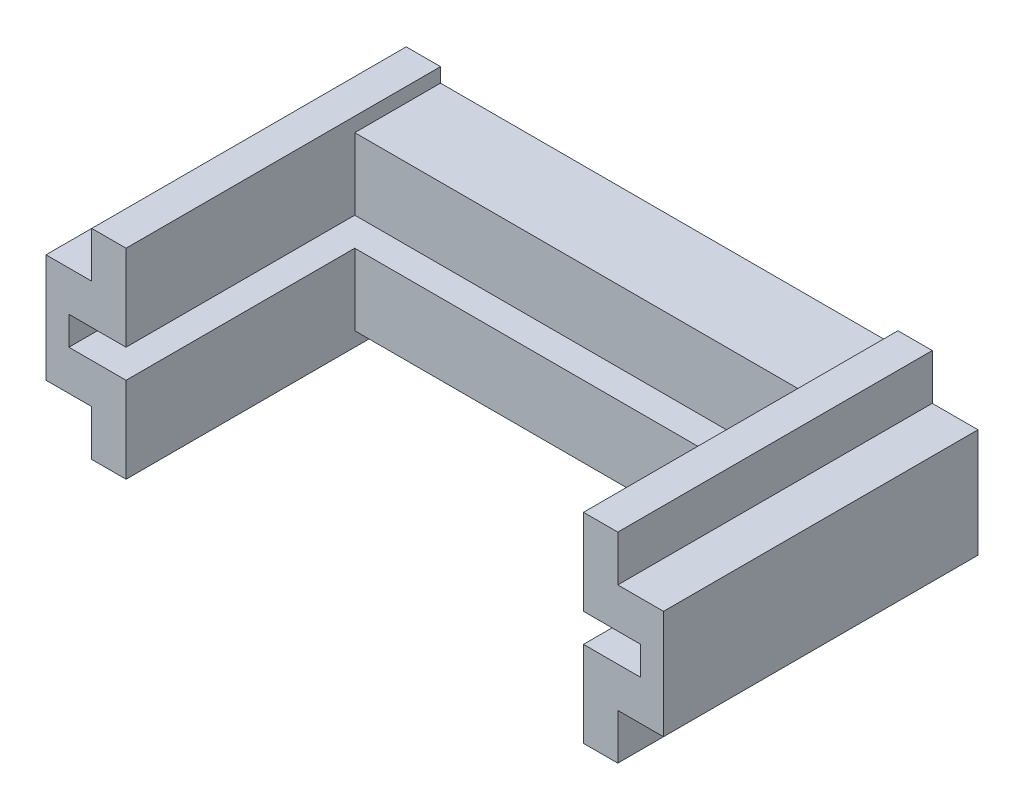
ISO-10303-21;
HEADER;
FILE_DESCRIPTION(('STEP AP214'),'2;1');
FILE_NAME('part.step','',(''),(''),'','','');
FILE_SCHEMA(('AUTOMOTIVE_DESIGN { 1 0 10303 214 1 1 1 1 }'));
ENDSEC;
DATA;
#1=APPLICATION_CONTEXT('core data for automotive mechanical design processes');
#2=APPLICATION_PROTOCOL_DEFINITION('international standard','automotive_design',2000,#1);
#3=PRODUCT_CONTEXT('',#1,'mechanical');
#4=PRODUCT('Part','Part','',(#3));
#5=PRODUCT_RELATED_PRODUCT_CATEGORY('part','',(#4));
#6=PRODUCT_DEFINITION_FORMATION('','',#4);
#7=PRODUCT_DEFINITION_CONTEXT('part definition',#1,'design');
#8=PRODUCT_DEFINITION('design','',#6,#7);
#9=PRODUCT_DEFINITION_SHAPE('','',#8);
#10=(LENGTH_UNIT() NAMED_UNIT(*) SI_UNIT(.MILLI.,.METRE.));
#11=(NAMED_UNIT(*) PLANE_ANGLE_UNIT() SI_UNIT($,.RADIAN.));
#12=(NAMED_UNIT(*) SI_UNIT($,.STERADIAN.) SOLID_ANGLE_UNIT());
#13=UNCERTAINTY_MEASURE_WITH_UNIT(LENGTH_MEASURE(1.E-05),#10,'distance_accuracy_value','');
#14=(GEOMETRIC_REPRESENTATION_CONTEXT(3) GLOBAL_UNCERTAINTY_ASSIGNED_CONTEXT((#13)) GLOBAL_UNIT_ASSIGNED_CONTEXT((#10,
#11,#12)) REPRESENTATION_CONTEXT('',''));
#15=CARTESIAN_POINT('',(0.,0.,0.));
#16=DIRECTION('',(0.,0.,1.));
#17=DIRECTION('',(1.,0.,0.));
#18=AXIS2_PLACEMENT_3D('',#15,#16,#17);
#19=CARTESIAN_POINT('',(-29.21,-11.1125,9.525));
#20=DIRECTION('',(0.,1.,0.));
#21=DIRECTION('',(-1.,0.,0.));
#22=AXIS2_PLACEMENT_3D('',#19,#20,#21);
#23=PLANE('',#22);
#24=DIRECTION('',(1.,0.,0.));
#25=VECTOR('',#24,1.);
#26=CARTESIAN_POINT('',(-29.21,-11.1125,0.));
#27=LINE('',#26,#25);
#28=CARTESIAN_POINT('',(-29.21,-11.1125,0.));
#29=VERTEX_POINT('',#28);
#30=CARTESIAN_POINT('',(-25.4,-11.1125,0.));
#31=VERTEX_POINT('',#30);
#32=EDGE_CURVE('E385',#29,#31,#27,.T.);
#33=ORIENTED_EDGE('',*,*,#32,.T.);
#34=DIRECTION('',(0.,0.,-1.));
#35=VECTOR('',#34,1.);
#36=CARTESIAN_POINT('',(-25.4,-11.1125,34.925));
#37=LINE('',#36,#35);
#38=CARTESIAN_POINT('',(-25.4,-11.1125,34.925));
#39=VERTEX_POINT('',#38);
#40=EDGE_CURVE('E358',#39,#31,#37,.T.);
#41=ORIENTED_EDGE('',*,*,#40,.F.);
#42=DIRECTION('',(1.,0.,0.));
#43=VECTOR('',#42,1.);
#44=CARTESIAN_POINT('',(-29.21,-11.1125,34.925));
#45=LINE('',#44,#43);
#46=CARTESIAN_POINT('',(-29.21,-11.1125,34.925));
#47=VERTEX_POINT('',#46);
#48=EDGE_CURVE('E356',#47,#39,#45,.T.);
#49=ORIENTED_EDGE('',*,*,#48,.F.);
#50=DIRECTION('',(0.,0.,-1.));
#51=VECTOR('',#50,1.);
#52=CARTESIAN_POINT('',(-29.21,-11.1125,9.525));
#53=LINE('',#52,#51);
#54=EDGE_CURVE('E422',#47,#29,#53,.T.);
#55=ORIENTED_EDGE('',*,*,#54,.T.);
#56=EDGE_LOOP('',(#33,#41,#49,#55));
#57=FACE_BOUND('',#56,.T.);
#58=ADVANCED_FACE('F33',(#57),#23,.F.);
#59=CARTESIAN_POINT('',(-29.21,11.1125,9.525));
#60=DIRECTION('',(0.,-1.,0.));
#61=DIRECTION('',(1.,0.,0.));
#62=AXIS2_PLACEMENT_3D('',#59,#60,#61);
#63=PLANE('',#62);
#64=DIRECTION('',(0.,0.,-1.));
#65=VECTOR('',#64,1.);
#66=CARTESIAN_POINT('',(-25.4,11.1125,34.925));
#67=LINE('',#66,#65);
#68=CARTESIAN_POINT('',(-25.4,11.1125,34.925));
#69=VERTEX_POINT('',#68);
#70=CARTESIAN_POINT('',(-25.4,11.1125,0.));
#71=VERTEX_POINT('',#70);
#72=EDGE_CURVE('E362',#69,#71,#67,.T.);
#73=ORIENTED_EDGE('',*,*,#72,.T.);
#74=DIRECTION('',(-1.,0.,0.));
#75=VECTOR('',#74,1.);
#76=CARTESIAN_POINT('',(-29.21,11.1125,0.));
#77=LINE('',#76,#75);
#78=CARTESIAN_POINT('',(-29.21,11.1125,0.));
#79=VERTEX_POINT('',#78);
#80=EDGE_CURVE('E240',#71,#79,#77,.T.);
#81=ORIENTED_EDGE('',*,*,#80,.T.);
#82=DIRECTION('',(0.,0.,-1.));
#83=VECTOR('',#82,1.);
#84=CARTESIAN_POINT('',(-29.21,11.1125,9.525));
#85=LINE('',#84,#83);
#86=CARTESIAN_POINT('',(-29.21,11.1125,34.925));
#87=VERTEX_POINT('',#86);
#88=EDGE_CURVE('E401',#87,#79,#85,.T.);
#89=ORIENTED_EDGE('',*,*,#88,.F.);
#90=DIRECTION('',(-1.,0.,0.));
#91=VECTOR('',#90,1.);
#92=CARTESIAN_POINT('',(-29.21,11.1125,34.925));
#93=LINE('',#92,#91);
#94=EDGE_CURVE('E338',#69,#87,#93,.T.);
#95=ORIENTED_EDGE('',*,*,#94,.F.);
#96=EDGE_LOOP('',(#73,#81,#89,#95));
#97=FACE_BOUND('',#96,.T.);
#98=ADVANCED_FACE('F474',(#97),#63,.F.);
#99=CARTESIAN_POINT('',(0.,0.,9.525));
#100=DIRECTION('',(0.,0.,1.));
#101=DIRECTION('',(1.,0.,0.));
#102=AXIS2_PLACEMENT_3D('',#99,#100,#101);
#103=PLANE('',#102);
#104=DIRECTION('',(1.,0.,0.));
#105=VECTOR('',#104,1.);
#106=CARTESIAN_POINT('',(0.,9.525,9.525));
#107=LINE('',#106,#105);
#108=CARTESIAN_POINT('',(-25.4,9.525,9.525));
#109=VERTEX_POINT('',#108);
#110=CARTESIAN_POINT('',(25.4,9.525,9.525));
#111=VERTEX_POINT('',#110);
#112=EDGE_CURVE('E248',#109,#111,#107,.T.);
#113=ORIENTED_EDGE('',*,*,#112,.F.);
#114=DIRECTION('',(0.,1.,0.));
#115=VECTOR('',#114,1.);
#116=CARTESIAN_POINT('',(-25.4,11.1125,9.525));
#117=LINE('',#116,#115);
#118=CARTESIAN_POINT('',(-25.4,1.5875,9.525));
#119=VERTEX_POINT('',#118);
#120=EDGE_CURVE('E228',#119,#109,#117,.T.);
#121=ORIENTED_EDGE('',*,*,#120,.F.);
#122=DIRECTION('',(-1.,0.,0.));
#123=VECTOR('',#122,1.);
#124=CARTESIAN_POINT('',(-31.75,1.5875,9.525));
#125=LINE('',#124,#123);
#126=CARTESIAN_POINT('',(25.4,1.5875,9.525));
#127=VERTEX_POINT('',#126);
#128=EDGE_CURVE('E266',#127,#119,#125,.T.);
#129=ORIENTED_EDGE('',*,*,#128,.F.);
#130=DIRECTION('',(0.,-1.,0.));
#131=VECTOR('',#130,1.);
#132=CARTESIAN_POINT('',(25.4,11.1125,9.525));
#133=LINE('',#132,#131);
#134=EDGE_CURVE('E282',#111,#127,#133,.T.);
#135=ORIENTED_EDGE('',*,*,#134,.F.);
#136=EDGE_LOOP('',(#113,#121,#129,#135));
#137=FACE_BOUND('',#136,.T.);
#138=ADVANCED_FACE('F491',(#137),#103,.T.);
#139=DIRECTION('',(-1.,0.,0.));
#140=VECTOR('',#139,1.);
#141=CARTESIAN_POINT('',(0.,-9.525,9.525));
#142=LINE('',#141,#140);
#143=CARTESIAN_POINT('',(25.4,-9.525,9.525));
#144=VERTEX_POINT('',#143);
#145=CARTESIAN_POINT('',(-25.4,-9.525,9.525));
#146=VERTEX_POINT('',#145);
#147=EDGE_CURVE('E259',#144,#146,#142,.T.);
#148=ORIENTED_EDGE('',*,*,#147,.F.);
#149=DIRECTION('',(0.,-1.,0.));
#150=VECTOR('',#149,1.);
#151=CARTESIAN_POINT('',(25.4,-1.58750000000004,9.525));
#152=LINE('',#151,#150);
#153=CARTESIAN_POINT('',(25.4,-1.5875,9.525));
#154=VERTEX_POINT('',#153);
#155=EDGE_CURVE('E275',#154,#144,#152,.T.);
#156=ORIENTED_EDGE('',*,*,#155,.F.);
#157=DIRECTION('',(1.,0.,0.));
#158=VECTOR('',#157,1.);
#159=CARTESIAN_POINT('',(-31.75,-1.5875,9.525));
#160=LINE('',#159,#158);
#161=CARTESIAN_POINT('',(-25.4,-1.5875,9.525));
#162=VERTEX_POINT('',#161);
#163=EDGE_CURVE('E261',#162,#154,#160,.T.);
#164=ORIENTED_EDGE('',*,*,#163,.F.);
#165=DIRECTION('',(0.,1.,0.));
#166=VECTOR('',#165,1.);
#167=CARTESIAN_POINT('',(-25.4,-1.5875,9.525));
#168=LINE('',#167,#166);
#169=EDGE_CURVE('E327',#146,#162,#168,.T.);
#170=ORIENTED_EDGE('',*,*,#169,.F.);
#171=EDGE_LOOP('',(#148,#156,#164,#170));
#172=FACE_BOUND('',#171,.T.);
#173=ADVANCED_FACE('F484',(#172),#103,.T.);
#174=CARTESIAN_POINT('',(-29.21,11.1125,9.525));
#175=DIRECTION('',(1.,0.,0.));
#176=DIRECTION('',(0.,0.,-1.));
#177=AXIS2_PLACEMENT_3D('',#174,#175,#176);
#178=PLANE('',#177);
#179=DIRECTION('',(0.,-1.,0.));
#180=VECTOR('',#179,1.);
#181=CARTESIAN_POINT('',(-29.21,11.1125,0.));
#182=LINE('',#181,#180);
#183=CARTESIAN_POINT('',(-29.21,6.0325,0.));
#184=VERTEX_POINT('',#183);
#185=EDGE_CURVE('E373',#79,#184,#182,.T.);
#186=ORIENTED_EDGE('',*,*,#185,.T.);
#187=DIRECTION('',(0.,0.,-1.));
#188=VECTOR('',#187,1.);
#189=CARTESIAN_POINT('',(-29.21,6.0325,9.525));
#190=LINE('',#189,#188);
#191=CARTESIAN_POINT('',(-29.21,6.0325,34.925));
#192=VERTEX_POINT('',#191);
#193=EDGE_CURVE('E11',#192,#184,#190,.T.);
#194=ORIENTED_EDGE('',*,*,#193,.F.);
#195=DIRECTION('',(0.,-1.,0.));
#196=VECTOR('',#195,1.);
#197=CARTESIAN_POINT('',(-29.21,11.1125,34.925));
#198=LINE('',#197,#196);
#199=EDGE_CURVE('E341',#87,#192,#198,.T.);
#200=ORIENTED_EDGE('',*,*,#199,.F.);
#201=ORIENTED_EDGE('',*,*,#88,.T.);
#202=EDGE_LOOP('',(#186,#194,#200,#201));
#203=FACE_BOUND('',#202,.T.);
#204=ADVANCED_FACE('F35',(#203),#178,.F.);
#205=CARTESIAN_POINT('',(-34.29,6.0325,9.525));
#206=DIRECTION('',(0.,-1.,0.));
#207=DIRECTION('',(0.,0.,-1.));
#208=AXIS2_PLACEMENT_3D('',#205,#206,#207);
#209=PLANE('',#208);
#210=DIRECTION('',(-1.,0.,0.));
#211=VECTOR('',#210,1.);
#212=CARTESIAN_POINT('',(-34.29,6.0325,0.));
#213=LINE('',#212,#211);
#214=CARTESIAN_POINT('',(-34.29,6.0325,0.));
#215=VERTEX_POINT('',#214);
#216=EDGE_CURVE('E376',#184,#215,#213,.T.);
#217=ORIENTED_EDGE('',*,*,#216,.T.);
#218=DIRECTION('',(0.,0.,-1.));
#219=VECTOR('',#218,1.);
#220=CARTESIAN_POINT('',(-34.29,6.0325,9.525));
#221=LINE('',#220,#219);
#222=CARTESIAN_POINT('',(-34.29,6.0325,34.925));
#223=VERTEX_POINT('',#222);
#224=EDGE_CURVE('E41',#223,#215,#221,.T.);
#225=ORIENTED_EDGE('',*,*,#224,.F.);
#226=DIRECTION('',(-1.,0.,0.));
#227=VECTOR('',#226,1.);
#228=CARTESIAN_POINT('',(-34.29,6.0325,34.925));
#229=LINE('',#228,#227);
#230=EDGE_CURVE('E344',#192,#223,#229,.T.);
#231=ORIENTED_EDGE('',*,*,#230,.F.);
#232=ORIENTED_EDGE('',*,*,#193,.T.);
#233=EDGE_LOOP('',(#217,#225,#231,#232));
#234=FACE_BOUND('',#233,.T.);
#235=ADVANCED_FACE('F477',(#234),#209,.F.);
#236=CARTESIAN_POINT('',(-34.29,-6.0325,9.525));
#237=DIRECTION('',(1.,0.,0.));
#238=DIRECTION('',(0.,1.,0.));
#239=AXIS2_PLACEMENT_3D('',#236,#237,#238);
#240=PLANE('',#239);
#241=DIRECTION('',(0.,-1.,0.));
#242=VECTOR('',#241,1.);
#243=CARTESIAN_POINT('',(-34.29,-6.0325,0.));
#244=LINE('',#243,#242);
#245=CARTESIAN_POINT('',(-34.29,-6.0325,0.));
#246=VERTEX_POINT('',#245);
#247=EDGE_CURVE('E378',#215,#246,#244,.T.);
#248=ORIENTED_EDGE('',*,*,#247,.T.);
#249=DIRECTION('',(0.,0.,-1.));
#250=VECTOR('',#249,1.);
#251=CARTESIAN_POINT('',(-34.29,-6.0325,9.525));
#252=LINE('',#251,#250);
#253=CARTESIAN_POINT('',(-34.29,-6.0325,34.925));
#254=VERTEX_POINT('',#253);
#255=EDGE_CURVE('E428',#254,#246,#252,.T.);
#256=ORIENTED_EDGE('',*,*,#255,.F.);
#257=DIRECTION('',(0.,-1.,0.));
#258=VECTOR('',#257,1.);
#259=CARTESIAN_POINT('',(-34.29,6.0325,34.925));
#260=LINE('',#259,#258);
#261=EDGE_CURVE('E347',#223,#254,#260,.T.);
#262=ORIENTED_EDGE('',*,*,#261,.F.);
#263=ORIENTED_EDGE('',*,*,#224,.T.);
#264=EDGE_LOOP('',(#248,#256,#262,#263));
#265=FACE_BOUND('',#264,.T.);
#266=ADVANCED_FACE('F434',(#265),#240,.F.);
#267=CARTESIAN_POINT('',(-34.29,-6.0325,9.525));
#268=DIRECTION('',(0.,1.,0.));
#269=DIRECTION('',(0.,0.,1.));
#270=AXIS2_PLACEMENT_3D('',#267,#268,#269);
#271=PLANE('',#270);
#272=DIRECTION('',(1.,0.,0.));
#273=VECTOR('',#272,1.);
#274=CARTESIAN_POINT('',(-34.29,-6.0325,0.));
#275=LINE('',#274,#273);
#276=CARTESIAN_POINT('',(-29.21,-6.0325,0.));
#277=VERTEX_POINT('',#276);
#278=EDGE_CURVE('E380',#246,#277,#275,.T.);
#279=ORIENTED_EDGE('',*,*,#278,.T.);
#280=DIRECTION('',(0.,0.,-1.));
#281=VECTOR('',#280,1.);
#282=CARTESIAN_POINT('',(-29.21,-6.0325,9.525));
#283=LINE('',#282,#281);
#284=CARTESIAN_POINT('',(-29.21,-6.0325,34.925));
#285=VERTEX_POINT('',#284);
#286=EDGE_CURVE('E425',#285,#277,#283,.T.);
#287=ORIENTED_EDGE('',*,*,#286,.F.);
#288=DIRECTION('',(1.,0.,0.));
#289=VECTOR('',#288,1.);
#290=CARTESIAN_POINT('',(-29.21,-6.0325,34.925));
#291=LINE('',#290,#289);
#292=EDGE_CURVE('E350',#254,#285,#291,.T.);
#293=ORIENTED_EDGE('',*,*,#292,.F.);
#294=ORIENTED_EDGE('',*,*,#255,.T.);
#295=EDGE_LOOP('',(#279,#287,#293,#294));
#296=FACE_BOUND('',#295,.T.);
#297=ADVANCED_FACE('F441',(#296),#271,.F.);
#298=CARTESIAN_POINT('',(-29.21,-11.1125,9.525));
#299=DIRECTION('',(1.,0.,0.));
#300=DIRECTION('',(0.,0.,-1.));
#301=AXIS2_PLACEMENT_3D('',#298,#299,#300);
#302=PLANE('',#301);
#303=DIRECTION('',(0.,-1.,0.));
#304=VECTOR('',#303,1.);
#305=CARTESIAN_POINT('',(-29.21,-11.1125,0.));
#306=LINE('',#305,#304);
#307=EDGE_CURVE('E382',#277,#29,#306,.T.);
#308=ORIENTED_EDGE('',*,*,#307,.T.);
#309=ORIENTED_EDGE('',*,*,#54,.F.);
#310=DIRECTION('',(0.,-1.,0.));
#311=VECTOR('',#310,1.);
#312=CARTESIAN_POINT('',(-29.21,-6.0325,34.925));
#313=LINE('',#312,#311);
#314=EDGE_CURVE('E353',#285,#47,#313,.T.);
#315=ORIENTED_EDGE('',*,*,#314,.F.);
#316=ORIENTED_EDGE('',*,*,#286,.T.);
#317=EDGE_LOOP('',(#308,#309,#315,#316));
#318=FACE_BOUND('',#317,.T.);
#319=ADVANCED_FACE('F445',(#318),#302,.F.);
#320=DIRECTION('',(0.,0.,-1.));
#321=VECTOR('',#320,1.);
#322=CARTESIAN_POINT('',(25.4,-11.1125,34.925));
#323=LINE('',#322,#321);
#324=CARTESIAN_POINT('',(25.4,-11.1125,34.925));
#325=VERTEX_POINT('',#324);
#326=CARTESIAN_POINT('',(25.4,-11.1125,0.));
#327=VERTEX_POINT('',#326);
#328=EDGE_CURVE('E322',#325,#327,#323,.T.);
#329=ORIENTED_EDGE('',*,*,#328,.T.);
#330=CARTESIAN_POINT('',(29.21,-11.1125,0.));
#331=VERTEX_POINT('',#330);
#332=EDGE_CURVE('E384',#327,#331,#27,.T.);
#333=ORIENTED_EDGE('',*,*,#332,.T.);
#334=DIRECTION('',(0.,0.,-1.));
#335=VECTOR('',#334,1.);
#336=CARTESIAN_POINT('',(29.21,-11.1125,9.525));
#337=LINE('',#336,#335);
#338=CARTESIAN_POINT('',(29.21,-11.1125,34.925));
#339=VERTEX_POINT('',#338);
#340=EDGE_CURVE('E419',#339,#331,#337,.T.);
#341=ORIENTED_EDGE('',*,*,#340,.F.);
#342=DIRECTION('',(1.,0.,0.));
#343=VECTOR('',#342,1.);
#344=CARTESIAN_POINT('',(29.21,-11.1125,34.925));
#345=LINE('',#344,#343);
#346=EDGE_CURVE('E284',#325,#339,#345,.T.);
#347=ORIENTED_EDGE('',*,*,#346,.F.);
#348=EDGE_LOOP('',(#329,#333,#341,#347));
#349=FACE_BOUND('',#348,.T.);
#350=ADVANCED_FACE('F487',(#349),#23,.F.);
#351=CARTESIAN_POINT('',(29.21,-11.1125,9.525));
#352=DIRECTION('',(-1.,0.,0.));
#353=DIRECTION('',(0.,0.,1.));
#354=AXIS2_PLACEMENT_3D('',#351,#352,#353);
#355=PLANE('',#354);
#356=DIRECTION('',(0.,1.,0.));
#357=VECTOR('',#356,1.);
#358=CARTESIAN_POINT('',(29.21,-11.1125,0.));
#359=LINE('',#358,#357);
#360=CARTESIAN_POINT('',(29.21,-6.0325,0.));
#361=VERTEX_POINT('',#360);
#362=EDGE_CURVE('E388',#331,#361,#359,.T.);
#363=ORIENTED_EDGE('',*,*,#362,.T.);
#364=DIRECTION('',(0.,0.,-1.));
#365=VECTOR('',#364,1.);
#366=CARTESIAN_POINT('',(29.21,-6.0325,9.525));
#367=LINE('',#366,#365);
#368=CARTESIAN_POINT('',(29.21,-6.0325,34.925));
#369=VERTEX_POINT('',#368);
#370=EDGE_CURVE('E416',#369,#361,#367,.T.);
#371=ORIENTED_EDGE('',*,*,#370,.F.);
#372=DIRECTION('',(0.,1.,0.));
#373=VECTOR('',#372,1.);
#374=CARTESIAN_POINT('',(29.21,-11.1125,34.925));
#375=LINE('',#374,#373);
#376=EDGE_CURVE('E287',#339,#369,#375,.T.);
#377=ORIENTED_EDGE('',*,*,#376,.F.);
#378=ORIENTED_EDGE('',*,*,#340,.T.);
#379=EDGE_LOOP('',(#363,#371,#377,#378));
#380=FACE_BOUND('',#379,.T.);
#381=ADVANCED_FACE('F497',(#380),#355,.F.);
#382=CARTESIAN_POINT('',(34.29,-6.0325,9.525));
#383=DIRECTION('',(0.,1.,0.));
#384=DIRECTION('',(0.,0.,1.));
#385=AXIS2_PLACEMENT_3D('',#382,#383,#384);
#386=PLANE('',#385);
#387=DIRECTION('',(1.,0.,0.));
#388=VECTOR('',#387,1.);
#389=CARTESIAN_POINT('',(34.29,-6.0325,0.));
#390=LINE('',#389,#388);
#391=CARTESIAN_POINT('',(34.29,-6.0325,0.));
#392=VERTEX_POINT('',#391);
#393=EDGE_CURVE('E390',#361,#392,#390,.T.);
#394=ORIENTED_EDGE('',*,*,#393,.T.);
#395=DIRECTION('',(0.,0.,-1.));
#396=VECTOR('',#395,1.);
#397=CARTESIAN_POINT('',(34.29,-6.0325,9.525));
#398=LINE('',#397,#396);
#399=CARTESIAN_POINT('',(34.29,-6.0325,34.925));
#400=VERTEX_POINT('',#399);
#401=EDGE_CURVE('E413',#400,#392,#398,.T.);
#402=ORIENTED_EDGE('',*,*,#401,.F.);
#403=DIRECTION('',(1.,0.,0.));
#404=VECTOR('',#403,1.);
#405=CARTESIAN_POINT('',(34.29,-6.0325,34.925));
#406=LINE('',#405,#404);
#407=EDGE_CURVE('E290',#369,#400,#406,.T.);
#408=ORIENTED_EDGE('',*,*,#407,.F.);
#409=ORIENTED_EDGE('',*,*,#370,.T.);
#410=EDGE_LOOP('',(#394,#402,#408,#409));
#411=FACE_BOUND('',#410,.T.);
#412=ADVANCED_FACE('F503',(#411),#386,.F.);
#413=CARTESIAN_POINT('',(34.29,-6.0325,9.525));
#414=DIRECTION('',(-1.,0.,0.));
#415=DIRECTION('',(0.,-1.,0.));
#416=AXIS2_PLACEMENT_3D('',#413,#414,#415);
#417=PLANE('',#416);
#418=DIRECTION('',(0.,1.,0.));
#419=VECTOR('',#418,1.);
#420=CARTESIAN_POINT('',(34.29,-6.0325,0.));
#421=LINE('',#420,#419);
#422=CARTESIAN_POINT('',(34.29,6.0325,0.));
#423=VERTEX_POINT('',#422);
#424=EDGE_CURVE('E392',#392,#423,#421,.T.);
#425=ORIENTED_EDGE('',*,*,#424,.T.);
#426=DIRECTION('',(0.,0.,-1.));
#427=VECTOR('',#426,1.);
#428=CARTESIAN_POINT('',(34.29,6.0325,9.525));
#429=LINE('',#428,#427);
#430=CARTESIAN_POINT('',(34.29,6.0325,34.925));
#431=VERTEX_POINT('',#430);
#432=EDGE_CURVE('E410',#431,#423,#429,.T.);
#433=ORIENTED_EDGE('',*,*,#432,.F.);
#434=DIRECTION('',(0.,1.,0.));
#435=VECTOR('',#434,1.);
#436=CARTESIAN_POINT('',(34.29,6.0325,34.925));
#437=LINE('',#436,#435);
#438=EDGE_CURVE('E293',#400,#431,#437,.T.);
#439=ORIENTED_EDGE('',*,*,#438,.F.);
#440=ORIENTED_EDGE('',*,*,#401,.T.);
#441=EDGE_LOOP('',(#425,#433,#439,#440));
#442=FACE_BOUND('',#441,.T.);
#443=ADVANCED_FACE('F522',(#442),#417,.F.);
#444=CARTESIAN_POINT('',(34.29,6.0325,9.525));
#445=DIRECTION('',(0.,-1.,0.));
#446=DIRECTION('',(0.,0.,-1.));
#447=AXIS2_PLACEMENT_3D('',#444,#445,#446);
#448=PLANE('',#447);
#449=DIRECTION('',(-1.,0.,0.));
#450=VECTOR('',#449,1.);
#451=CARTESIAN_POINT('',(34.29,6.0325,0.));
#452=LINE('',#451,#450);
#453=CARTESIAN_POINT('',(29.21,6.0325,0.));
#454=VERTEX_POINT('',#453);
#455=EDGE_CURVE('E394',#423,#454,#452,.T.);
#456=ORIENTED_EDGE('',*,*,#455,.T.);
#457=DIRECTION('',(0.,0.,-1.));
#458=VECTOR('',#457,1.);
#459=CARTESIAN_POINT('',(29.21,6.0325,9.525));
#460=LINE('',#459,#458);
#461=CARTESIAN_POINT('',(29.21,6.0325,34.925));
#462=VERTEX_POINT('',#461);
#463=EDGE_CURVE('E407',#462,#454,#460,.T.);
#464=ORIENTED_EDGE('',*,*,#463,.F.);
#465=DIRECTION('',(-1.,0.,0.));
#466=VECTOR('',#465,1.);
#467=CARTESIAN_POINT('',(34.29,6.0325,34.925));
#468=LINE('',#467,#466);
#469=EDGE_CURVE('E296',#431,#462,#468,.T.);
#470=ORIENTED_EDGE('',*,*,#469,.F.);
#471=ORIENTED_EDGE('',*,*,#432,.T.);
#472=EDGE_LOOP('',(#456,#464,#470,#471));
#473=FACE_BOUND('',#472,.T.);
#474=ADVANCED_FACE('F525',(#473),#448,.F.);
#475=CARTESIAN_POINT('',(29.21,11.1125,9.525));
#476=DIRECTION('',(-1.,0.,0.));
#477=DIRECTION('',(0.,0.,1.));
#478=AXIS2_PLACEMENT_3D('',#475,#476,#477);
#479=PLANE('',#478);
#480=DIRECTION('',(0.,1.,0.));
#481=VECTOR('',#480,1.);
#482=CARTESIAN_POINT('',(29.21,11.1125,0.));
#483=LINE('',#482,#481);
#484=CARTESIAN_POINT('',(29.21,11.1125,0.));
#485=VERTEX_POINT('',#484);
#486=EDGE_CURVE('E396',#454,#485,#483,.T.);
#487=ORIENTED_EDGE('',*,*,#486,.T.);
#488=DIRECTION('',(0.,0.,-1.));
#489=VECTOR('',#488,1.);
#490=CARTESIAN_POINT('',(29.21,11.1125,9.525));
#491=LINE('',#490,#489);
#492=CARTESIAN_POINT('',(29.21,11.1125,34.925));
#493=VERTEX_POINT('',#492);
#494=EDGE_CURVE('E404',#493,#485,#491,.T.);
#495=ORIENTED_EDGE('',*,*,#494,.F.);
#496=DIRECTION('',(0.,1.,0.));
#497=VECTOR('',#496,1.);
#498=CARTESIAN_POINT('',(29.21,11.1125,34.925));
#499=LINE('',#498,#497);
#500=EDGE_CURVE('E299',#462,#493,#499,.T.);
#501=ORIENTED_EDGE('',*,*,#500,.F.);
#502=ORIENTED_EDGE('',*,*,#463,.T.);
#503=EDGE_LOOP('',(#487,#495,#501,#502));
#504=FACE_BOUND('',#503,.T.);
#505=ADVANCED_FACE('F529',(#504),#479,.F.);
#506=CARTESIAN_POINT('',(25.4,11.1125,0.));
#507=VERTEX_POINT('',#506);
#508=EDGE_CURVE('E398',#485,#507,#77,.T.);
#509=ORIENTED_EDGE('',*,*,#508,.T.);
#510=DIRECTION('',(0.,0.,-1.));
#511=VECTOR('',#510,1.);
#512=CARTESIAN_POINT('',(25.4,11.1125,34.925));
#513=LINE('',#512,#511);
#514=CARTESIAN_POINT('',(25.4,11.1125,34.925));
#515=VERTEX_POINT('',#514);
#516=EDGE_CURVE('E320',#515,#507,#513,.T.);
#517=ORIENTED_EDGE('',*,*,#516,.F.);
#518=DIRECTION('',(-1.,0.,0.));
#519=VECTOR('',#518,1.);
#520=CARTESIAN_POINT('',(29.21,11.1125,34.925));
#521=LINE('',#520,#519);
#522=EDGE_CURVE('E302',#493,#515,#521,.T.);
#523=ORIENTED_EDGE('',*,*,#522,.F.);
#524=ORIENTED_EDGE('',*,*,#494,.T.);
#525=EDGE_LOOP('',(#509,#517,#523,#524));
#526=FACE_BOUND('',#525,.T.);
#527=ADVANCED_FACE('F493',(#526),#63,.F.);
#528=CARTESIAN_POINT('',(0.,0.,0.));
#529=DIRECTION('',(0.,0.,1.));
#530=DIRECTION('',(1.,0.,0.));
#531=AXIS2_PLACEMENT_3D('',#528,#529,#530);
#532=PLANE('',#531);
#533=ORIENTED_EDGE('',*,*,#80,.F.);
#534=DIRECTION('',(0.,-1.,0.));
#535=VECTOR('',#534,1.);
#536=CARTESIAN_POINT('',(-25.4,11.1125,0.));
#537=LINE('',#536,#535);
#538=CARTESIAN_POINT('',(-25.4,9.525,0.));
#539=VERTEX_POINT('',#538);
#540=EDGE_CURVE('E224',#71,#539,#537,.T.);
#541=ORIENTED_EDGE('',*,*,#540,.T.);
#542=DIRECTION('',(1.,0.,0.));
#543=VECTOR('',#542,1.);
#544=CARTESIAN_POINT('',(-25.4,9.525,0.));
#545=LINE('',#544,#543);
#546=CARTESIAN_POINT('',(25.4,9.525,0.));
#547=VERTEX_POINT('',#546);
#548=EDGE_CURVE('E234',#539,#547,#545,.T.);
#549=ORIENTED_EDGE('',*,*,#548,.T.);
#550=DIRECTION('',(0.,1.,0.));
#551=VECTOR('',#550,1.);
#552=CARTESIAN_POINT('',(25.4,11.1125,0.));
#553=LINE('',#552,#551);
#554=EDGE_CURVE('E48',#547,#507,#553,.T.);
#555=ORIENTED_EDGE('',*,*,#554,.T.);
#556=ORIENTED_EDGE('',*,*,#508,.F.);
#557=ORIENTED_EDGE('',*,*,#486,.F.);
#558=ORIENTED_EDGE('',*,*,#455,.F.);
#559=ORIENTED_EDGE('',*,*,#424,.F.);
#560=ORIENTED_EDGE('',*,*,#393,.F.);
#561=ORIENTED_EDGE('',*,*,#362,.F.);
#562=ORIENTED_EDGE('',*,*,#332,.F.);
#563=DIRECTION('',(0.,1.,0.));
#564=VECTOR('',#563,1.);
#565=CARTESIAN_POINT('',(25.4,-11.1125,0.));
#566=LINE('',#565,#564);
#567=CARTESIAN_POINT('',(25.4,-9.525,0.));
#568=VERTEX_POINT('',#567);
#569=EDGE_CURVE('E250',#327,#568,#566,.T.);
#570=ORIENTED_EDGE('',*,*,#569,.T.);
#571=DIRECTION('',(-1.,0.,0.));
#572=VECTOR('',#571,1.);
#573=CARTESIAN_POINT('',(-25.4,-9.525,0.));
#574=LINE('',#573,#572);
#575=CARTESIAN_POINT('',(-25.4,-9.525,0.));
#576=VERTEX_POINT('',#575);
#577=EDGE_CURVE('E56',#568,#576,#574,.T.);
#578=ORIENTED_EDGE('',*,*,#577,.T.);
#579=DIRECTION('',(0.,-1.,0.));
#580=VECTOR('',#579,1.);
#581=CARTESIAN_POINT('',(-25.4,-11.1125,0.));
#582=LINE('',#581,#580);
#583=EDGE_CURVE('E254',#576,#31,#582,.T.);
#584=ORIENTED_EDGE('',*,*,#583,.T.);
#585=ORIENTED_EDGE('',*,*,#32,.F.);
#586=ORIENTED_EDGE('',*,*,#307,.F.);
#587=ORIENTED_EDGE('',*,*,#278,.F.);
#588=ORIENTED_EDGE('',*,*,#247,.F.);
#589=ORIENTED_EDGE('',*,*,#216,.F.);
#590=ORIENTED_EDGE('',*,*,#185,.F.);
#591=EDGE_LOOP('',(#533,#541,#549,#555,#556,#557,#558,#559,#560,#561,#562,#570,#578,#584,#585,
#586,#587,#588,#589,#590));
#592=FACE_BOUND('',#591,.T.);
#593=ADVANCED_FACE('F238',(#592),#532,.F.);
#594=CARTESIAN_POINT('',(-25.4,-1.5875,34.925));
#595=DIRECTION('',(-1.,0.,0.));
#596=DIRECTION('',(0.,-1.,0.));
#597=AXIS2_PLACEMENT_3D('',#594,#595,#596);
#598=PLANE('',#597);
#599=DIRECTION('',(0.,0.,-1.));
#600=VECTOR('',#599,1.);
#601=CARTESIAN_POINT('',(-25.4,-1.5875,34.925));
#602=LINE('',#601,#600);
#603=CARTESIAN_POINT('',(-25.4,-1.5875,34.925));
#604=VERTEX_POINT('',#603);
#605=EDGE_CURVE('E370',#604,#162,#602,.T.);
#606=ORIENTED_EDGE('',*,*,#605,.F.);
#607=DIRECTION('',(0.,1.,0.));
#608=VECTOR('',#607,1.);
#609=CARTESIAN_POINT('',(-25.4,-1.5875,34.925));
#610=LINE('',#609,#608);
#611=EDGE_CURVE('E328',#39,#604,#610,.T.);
#612=ORIENTED_EDGE('',*,*,#611,.F.);
#613=ORIENTED_EDGE('',*,*,#40,.T.);
#614=ORIENTED_EDGE('',*,*,#583,.F.);
#615=DIRECTION('',(0.,0.,1.));
#616=VECTOR('',#615,1.);
#617=CARTESIAN_POINT('',(-25.4,-9.525,0.));
#618=LINE('',#617,#616);
#619=EDGE_CURVE('E241',#576,#146,#618,.T.);
#620=ORIENTED_EDGE('',*,*,#619,.T.);
#621=ORIENTED_EDGE('',*,*,#169,.T.);
#622=EDGE_LOOP('',(#606,#612,#613,#614,#620,#621));
#623=FACE_BOUND('',#622,.T.);
#624=ADVANCED_FACE('F455',(#623),#598,.F.);
#625=CARTESIAN_POINT('',(-25.4,-1.5875,34.925));
#626=DIRECTION('',(0.,-1.,0.));
#627=DIRECTION('',(1.,0.,0.));
#628=AXIS2_PLACEMENT_3D('',#625,#626,#627);
#629=PLANE('',#628);
#630=ORIENTED_EDGE('',*,*,#605,.T.);
#631=ORIENTED_EDGE('',*,*,#163,.T.);
#632=DIRECTION('',(0.,0.,-1.));
#633=VECTOR('',#632,1.);
#634=CARTESIAN_POINT('',(25.4,-1.58750000000004,34.925));
#635=LINE('',#634,#633);
#636=CARTESIAN_POINT('',(25.4,-1.58750000000004,34.925));
#637=VERTEX_POINT('',#636);
#638=EDGE_CURVE('E324',#637,#154,#635,.T.);
#639=ORIENTED_EDGE('',*,*,#638,.F.);
#640=DIRECTION('',(-1.,0.,0.));
#641=VECTOR('',#640,1.);
#642=CARTESIAN_POINT('',(25.4,-1.58750000000004,34.925));
#643=LINE('',#642,#641);
#644=CARTESIAN_POINT('',(31.75,-1.5875,34.925));
#645=VERTEX_POINT('',#644);
#646=EDGE_CURVE('E278',#645,#637,#643,.T.);
#647=ORIENTED_EDGE('',*,*,#646,.F.);
#648=DIRECTION('',(0.,0.,-1.));
#649=VECTOR('',#648,1.);
#650=CARTESIAN_POINT('',(31.75,-1.5875,34.925));
#651=LINE('',#650,#649);
#652=CARTESIAN_POINT('',(31.75,-1.5875,3.175));
#653=VERTEX_POINT('',#652);
#654=EDGE_CURVE('E310',#645,#653,#651,.T.);
#655=ORIENTED_EDGE('',*,*,#654,.T.);
#656=DIRECTION('',(1.,0.,0.));
#657=VECTOR('',#656,1.);
#658=CARTESIAN_POINT('',(-31.75,-1.5875,3.175));
#659=LINE('',#658,#657);
#660=CARTESIAN_POINT('',(-31.75,-1.5875,3.175));
#661=VERTEX_POINT('',#660);
#662=EDGE_CURVE('E265',#661,#653,#659,.T.);
#663=ORIENTED_EDGE('',*,*,#662,.F.);
#664=DIRECTION('',(0.,0.,-1.));
#665=VECTOR('',#664,1.);
#666=CARTESIAN_POINT('',(-31.75,-1.5875,34.925));
#667=LINE('',#666,#665);
#668=CARTESIAN_POINT('',(-31.75,-1.5875,34.925));
#669=VERTEX_POINT('',#668);
#670=EDGE_CURVE('E368',#669,#661,#667,.T.);
#671=ORIENTED_EDGE('',*,*,#670,.F.);
#672=DIRECTION('',(-1.,0.,0.));
#673=VECTOR('',#672,1.);
#674=CARTESIAN_POINT('',(-25.4,-1.5875,34.925));
#675=LINE('',#674,#673);
#676=EDGE_CURVE('E330',#604,#669,#675,.T.);
#677=ORIENTED_EDGE('',*,*,#676,.F.);
#678=EDGE_LOOP('',(#630,#631,#639,#647,#655,#663,#671,#677));
#679=FACE_BOUND('',#678,.T.);
#680=ADVANCED_FACE('F459',(#679),#629,.F.);
#681=CARTESIAN_POINT('',(-31.75,1.5875,34.925));
#682=DIRECTION('',(-1.,0.,0.));
#683=DIRECTION('',(0.,0.,1.));
#684=AXIS2_PLACEMENT_3D('',#681,#682,#683);
#685=PLANE('',#684);
#686=ORIENTED_EDGE('',*,*,#670,.T.);
#687=DIRECTION('',(0.,-1.,0.));
#688=VECTOR('',#687,1.);
#689=CARTESIAN_POINT('',(-31.75,-1.5875,3.175));
#690=LINE('',#689,#688);
#691=CARTESIAN_POINT('',(-31.75,1.5875,3.175));
#692=VERTEX_POINT('',#691);
#693=EDGE_CURVE('E262',#692,#661,#690,.T.);
#694=ORIENTED_EDGE('',*,*,#693,.F.);
#695=DIRECTION('',(0.,0.,-1.));
#696=VECTOR('',#695,1.);
#697=CARTESIAN_POINT('',(-31.75,1.5875,34.925));
#698=LINE('',#697,#696);
#699=CARTESIAN_POINT('',(-31.75,1.5875,34.925));
#700=VERTEX_POINT('',#699);
#701=EDGE_CURVE('E366',#700,#692,#698,.T.);
#702=ORIENTED_EDGE('',*,*,#701,.F.);
#703=DIRECTION('',(0.,1.,0.));
#704=VECTOR('',#703,1.);
#705=CARTESIAN_POINT('',(-31.75,1.5875,34.925));
#706=LINE('',#705,#704);
#707=EDGE_CURVE('E332',#669,#700,#706,.T.);
#708=ORIENTED_EDGE('',*,*,#707,.F.);
#709=EDGE_LOOP('',(#686,#694,#702,#708));
#710=FACE_BOUND('',#709,.T.);
#711=ADVANCED_FACE('F465',(#710),#685,.F.);
#712=CARTESIAN_POINT('',(-25.4,1.5875,34.925));
#713=DIRECTION('',(0.,1.,0.));
#714=DIRECTION('',(-1.,0.,0.));
#715=AXIS2_PLACEMENT_3D('',#712,#713,#714);
#716=PLANE('',#715);
#717=ORIENTED_EDGE('',*,*,#701,.T.);
#718=DIRECTION('',(-1.,0.,0.));
#719=VECTOR('',#718,1.);
#720=CARTESIAN_POINT('',(-31.75,1.5875,3.175));
#721=LINE('',#720,#719);
#722=CARTESIAN_POINT('',(31.75,1.5875,3.175));
#723=VERTEX_POINT('',#722);
#724=EDGE_CURVE('E272',#723,#692,#721,.T.);
#725=ORIENTED_EDGE('',*,*,#724,.F.);
#726=DIRECTION('',(0.,0.,-1.));
#727=VECTOR('',#726,1.);
#728=CARTESIAN_POINT('',(31.75,1.5875,34.925));
#729=LINE('',#728,#727);
#730=CARTESIAN_POINT('',(31.75,1.5875,34.925));
#731=VERTEX_POINT('',#730);
#732=EDGE_CURVE('E315',#731,#723,#729,.T.);
#733=ORIENTED_EDGE('',*,*,#732,.F.);
#734=DIRECTION('',(1.,0.,0.));
#735=VECTOR('',#734,1.);
#736=CARTESIAN_POINT('',(25.4,1.58749999999996,34.925));
#737=LINE('',#736,#735);
#738=CARTESIAN_POINT('',(25.4,1.58749999999996,34.925));
#739=VERTEX_POINT('',#738);
#740=EDGE_CURVE('E306',#739,#731,#737,.T.);
#741=ORIENTED_EDGE('',*,*,#740,.F.);
#742=DIRECTION('',(0.,0.,-1.));
#743=VECTOR('',#742,1.);
#744=CARTESIAN_POINT('',(25.4,1.58749999999996,34.925));
#745=LINE('',#744,#743);
#746=EDGE_CURVE('E317',#739,#127,#745,.T.);
#747=ORIENTED_EDGE('',*,*,#746,.T.);
#748=ORIENTED_EDGE('',*,*,#128,.T.);
#749=DIRECTION('',(0.,0.,-1.));
#750=VECTOR('',#749,1.);
#751=CARTESIAN_POINT('',(-25.4,1.5875,34.925));
#752=LINE('',#751,#750);
#753=CARTESIAN_POINT('',(-25.4,1.5875,34.925));
#754=VERTEX_POINT('',#753);
#755=EDGE_CURVE('E364',#754,#119,#752,.T.);
#756=ORIENTED_EDGE('',*,*,#755,.F.);
#757=DIRECTION('',(1.,0.,0.));
#758=VECTOR('',#757,1.);
#759=CARTESIAN_POINT('',(-25.4,1.5875,34.925));
#760=LINE('',#759,#758);
#761=EDGE_CURVE('E334',#700,#754,#760,.T.);
#762=ORIENTED_EDGE('',*,*,#761,.F.);
#763=EDGE_LOOP('',(#717,#725,#733,#741,#747,#748,#756,#762));
#764=FACE_BOUND('',#763,.T.);
#765=ADVANCED_FACE('F470',(#764),#716,.F.);
#766=CARTESIAN_POINT('',(-25.4,11.1125,34.925));
#767=DIRECTION('',(-1.,0.,0.));
#768=DIRECTION('',(0.,-1.,0.));
#769=AXIS2_PLACEMENT_3D('',#766,#767,#768);
#770=PLANE('',#769);
#771=ORIENTED_EDGE('',*,*,#120,.T.);
#772=DIRECTION('',(0.,0.,1.));
#773=VECTOR('',#772,1.);
#774=CARTESIAN_POINT('',(-25.4,9.525,0.));
#775=LINE('',#774,#773);
#776=EDGE_CURVE('E219',#539,#109,#775,.T.);
#777=ORIENTED_EDGE('',*,*,#776,.F.);
#778=ORIENTED_EDGE('',*,*,#540,.F.);
#779=ORIENTED_EDGE('',*,*,#72,.F.);
#780=DIRECTION('',(0.,1.,0.));
#781=VECTOR('',#780,1.);
#782=CARTESIAN_POINT('',(-25.4,11.1125,34.925));
#783=LINE('',#782,#781);
#784=EDGE_CURVE('E336',#754,#69,#783,.T.);
#785=ORIENTED_EDGE('',*,*,#784,.F.);
#786=ORIENTED_EDGE('',*,*,#755,.T.);
#787=EDGE_LOOP('',(#771,#777,#778,#779,#785,#786));
#788=FACE_BOUND('',#787,.T.);
#789=ADVANCED_FACE('F221',(#788),#770,.F.);
#790=CARTESIAN_POINT('',(0.,0.,34.925));
#791=DIRECTION('',(0.,0.,1.));
#792=DIRECTION('',(1.,0.,0.));
#793=AXIS2_PLACEMENT_3D('',#790,#791,#792);
#794=PLANE('',#793);
#795=ORIENTED_EDGE('',*,*,#611,.T.);
#796=ORIENTED_EDGE('',*,*,#676,.T.);
#797=ORIENTED_EDGE('',*,*,#707,.T.);
#798=ORIENTED_EDGE('',*,*,#761,.T.);
#799=ORIENTED_EDGE('',*,*,#784,.T.);
#800=ORIENTED_EDGE('',*,*,#94,.T.);
#801=ORIENTED_EDGE('',*,*,#199,.T.);
#802=ORIENTED_EDGE('',*,*,#230,.T.);
#803=ORIENTED_EDGE('',*,*,#261,.T.);
#804=ORIENTED_EDGE('',*,*,#292,.T.);
#805=ORIENTED_EDGE('',*,*,#314,.T.);
#806=ORIENTED_EDGE('',*,*,#48,.T.);
#807=EDGE_LOOP('',(#795,#796,#797,#798,#799,#800,#801,#802,#803,#804,#805,#806));
#808=FACE_BOUND('',#807,.T.);
#809=ADVANCED_FACE('F448',(#808),#794,.T.);
#810=CARTESIAN_POINT('',(25.4,-1.58750000000004,34.925));
#811=DIRECTION('',(1.,0.,0.));
#812=DIRECTION('',(0.,1.,0.));
#813=AXIS2_PLACEMENT_3D('',#810,#811,#812);
#814=PLANE('',#813);
#815=ORIENTED_EDGE('',*,*,#155,.T.);
#816=DIRECTION('',(0.,0.,1.));
#817=VECTOR('',#816,1.);
#818=CARTESIAN_POINT('',(25.4,-9.525,0.));
#819=LINE('',#818,#817);
#820=EDGE_CURVE('E244',#568,#144,#819,.T.);
#821=ORIENTED_EDGE('',*,*,#820,.F.);
#822=ORIENTED_EDGE('',*,*,#569,.F.);
#823=ORIENTED_EDGE('',*,*,#328,.F.);
#824=DIRECTION('',(0.,-1.,0.));
#825=VECTOR('',#824,1.);
#826=CARTESIAN_POINT('',(25.4,-1.58750000000004,34.925));
#827=LINE('',#826,#825);
#828=EDGE_CURVE('E281',#637,#325,#827,.T.);
#829=ORIENTED_EDGE('',*,*,#828,.F.);
#830=ORIENTED_EDGE('',*,*,#638,.T.);
#831=EDGE_LOOP('',(#815,#821,#822,#823,#829,#830));
#832=FACE_BOUND('',#831,.T.);
#833=ADVANCED_FACE('F510',(#832),#814,.F.);
#834=CARTESIAN_POINT('',(25.4,11.1125,34.925));
#835=DIRECTION('',(1.,0.,0.));
#836=DIRECTION('',(0.,1.,0.));
#837=AXIS2_PLACEMENT_3D('',#834,#835,#836);
#838=PLANE('',#837);
#839=ORIENTED_EDGE('',*,*,#746,.F.);
#840=DIRECTION('',(0.,-1.,0.));
#841=VECTOR('',#840,1.);
#842=CARTESIAN_POINT('',(25.4,11.1125,34.925));
#843=LINE('',#842,#841);
#844=EDGE_CURVE('E304',#515,#739,#843,.T.);
#845=ORIENTED_EDGE('',*,*,#844,.F.);
#846=ORIENTED_EDGE('',*,*,#516,.T.);
#847=ORIENTED_EDGE('',*,*,#554,.F.);
#848=DIRECTION('',(0.,0.,1.));
#849=VECTOR('',#848,1.);
#850=CARTESIAN_POINT('',(25.4,9.525,0.));
#851=LINE('',#850,#849);
#852=EDGE_CURVE('E231',#547,#111,#851,.T.);
#853=ORIENTED_EDGE('',*,*,#852,.T.);
#854=ORIENTED_EDGE('',*,*,#134,.T.);
#855=EDGE_LOOP('',(#839,#845,#846,#847,#853,#854));
#856=FACE_BOUND('',#855,.T.);
#857=ADVANCED_FACE('F538',(#856),#838,.F.);
#858=CARTESIAN_POINT('',(31.75,1.5875,34.925));
#859=DIRECTION('',(1.,0.,0.));
#860=DIRECTION('',(0.,0.,-1.));
#861=AXIS2_PLACEMENT_3D('',#858,#859,#860);
#862=PLANE('',#861);
#863=ORIENTED_EDGE('',*,*,#732,.T.);
#864=DIRECTION('',(0.,1.,0.));
#865=VECTOR('',#864,1.);
#866=CARTESIAN_POINT('',(31.75,-1.5875,3.175));
#867=LINE('',#866,#865);
#868=EDGE_CURVE('E269',#653,#723,#867,.T.);
#869=ORIENTED_EDGE('',*,*,#868,.F.);
#870=ORIENTED_EDGE('',*,*,#654,.F.);
#871=DIRECTION('',(0.,-1.,0.));
#872=VECTOR('',#871,1.);
#873=CARTESIAN_POINT('',(31.75,1.5875,34.925));
#874=LINE('',#873,#872);
#875=EDGE_CURVE('E308',#731,#645,#874,.T.);
#876=ORIENTED_EDGE('',*,*,#875,.F.);
#877=EDGE_LOOP('',(#863,#869,#870,#876));
#878=FACE_BOUND('',#877,.T.);
#879=ADVANCED_FACE('F545',(#878),#862,.F.);
#880=CARTESIAN_POINT('',(0.,0.,34.925));
#881=DIRECTION('',(0.,0.,-1.));
#882=DIRECTION('',(-1.,0.,0.));
#883=AXIS2_PLACEMENT_3D('',#880,#881,#882);
#884=PLANE('',#883);
#885=ORIENTED_EDGE('',*,*,#646,.T.);
#886=ORIENTED_EDGE('',*,*,#828,.T.);
#887=ORIENTED_EDGE('',*,*,#346,.T.);
#888=ORIENTED_EDGE('',*,*,#376,.T.);
#889=ORIENTED_EDGE('',*,*,#407,.T.);
#890=ORIENTED_EDGE('',*,*,#438,.T.);
#891=ORIENTED_EDGE('',*,*,#469,.T.);
#892=ORIENTED_EDGE('',*,*,#500,.T.);
#893=ORIENTED_EDGE('',*,*,#522,.T.);
#894=ORIENTED_EDGE('',*,*,#844,.T.);
#895=ORIENTED_EDGE('',*,*,#740,.T.);
#896=ORIENTED_EDGE('',*,*,#875,.T.);
#897=EDGE_LOOP('',(#885,#886,#887,#888,#889,#890,#891,#892,#893,#894,#895,#896));
#898=FACE_BOUND('',#897,.T.);
#899=ADVANCED_FACE('F519',(#898),#884,.F.);
#900=CARTESIAN_POINT('',(0.,0.,3.175));
#901=DIRECTION('',(0.,0.,-1.));
#902=DIRECTION('',(-1.,0.,0.));
#903=AXIS2_PLACEMENT_3D('',#900,#901,#902);
#904=PLANE('',#903);
#905=ORIENTED_EDGE('',*,*,#693,.T.);
#906=ORIENTED_EDGE('',*,*,#662,.T.);
#907=ORIENTED_EDGE('',*,*,#868,.T.);
#908=ORIENTED_EDGE('',*,*,#724,.T.);
#909=EDGE_LOOP('',(#905,#906,#907,#908));
#910=FACE_BOUND('',#909,.T.);
#911=ADVANCED_FACE('F555',(#910),#904,.F.);
#912=CARTESIAN_POINT('',(-25.4,-9.525,0.));
#913=DIRECTION('',(0.,1.,0.));
#914=DIRECTION('',(0.,0.,1.));
#915=AXIS2_PLACEMENT_3D('',#912,#913,#914);
#916=PLANE('',#915);
#917=ORIENTED_EDGE('',*,*,#147,.T.);
#918=ORIENTED_EDGE('',*,*,#619,.F.);
#919=ORIENTED_EDGE('',*,*,#577,.F.);
#920=ORIENTED_EDGE('',*,*,#820,.T.);
#921=EDGE_LOOP('',(#917,#918,#919,#920));
#922=FACE_BOUND('',#921,.T.);
#923=ADVANCED_FACE('F553',(#922),#916,.F.);
#924=CARTESIAN_POINT('',(-25.4,9.525,0.));
#925=DIRECTION('',(0.,-1.,0.));
#926=DIRECTION('',(0.,0.,-1.));
#927=AXIS2_PLACEMENT_3D('',#924,#925,#926);
#928=PLANE('',#927);
#929=ORIENTED_EDGE('',*,*,#112,.T.);
#930=ORIENTED_EDGE('',*,*,#852,.F.);
#931=ORIENTED_EDGE('',*,*,#548,.F.);
#932=ORIENTED_EDGE('',*,*,#776,.T.);
#933=EDGE_LOOP('',(#929,#930,#931,#932));
#934=FACE_BOUND('',#933,.T.);
#935=ADVANCED_FACE('F235',(#934),#928,.F.);
#936=CLOSED_SHELL('',(#58,#98,#138,#173,#204,#235,#266,#297,#319,#350,#381,#412,#443,#474,#505,
#527,#593,#624,#680,#711,#765,#789,#809,#833,#857,#879,#899,#911,#923,#935));
#937=MANIFOLD_SOLID_BREP('B2',#936);
#938=ADVANCED_BREP_SHAPE_REPRESENTATION('',(#18,#937),#14);
#939=SHAPE_DEFINITION_REPRESENTATION(#9,#938);
ENDSEC;
END-ISO-10303-21;
